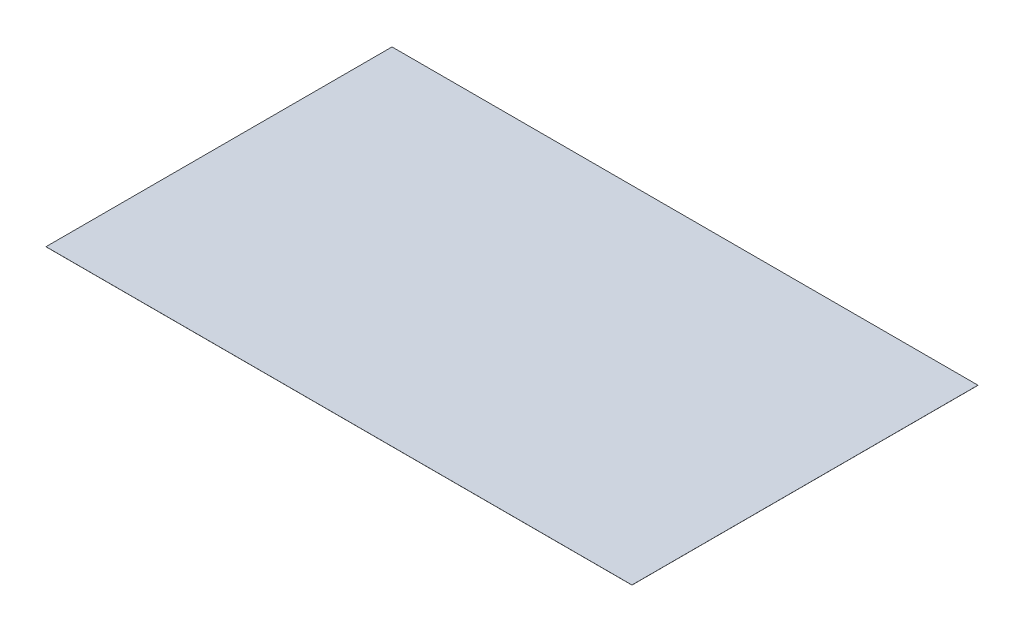
ISO-10303-21;
HEADER;
FILE_DESCRIPTION(('STEP AP214'),'2;1');
FILE_NAME('part.step','',(''),(''),'','','');
FILE_SCHEMA(('AUTOMOTIVE_DESIGN { 1 0 10303 214 1 1 1 1 }'));
ENDSEC;
DATA;
#1=APPLICATION_CONTEXT('core data for automotive mechanical design processes');
#2=APPLICATION_PROTOCOL_DEFINITION('international standard','automotive_design',2000,#1);
#3=PRODUCT_CONTEXT('',#1,'mechanical');
#4=PRODUCT('Part','Part','',(#3));
#5=PRODUCT_RELATED_PRODUCT_CATEGORY('part','',(#4));
#6=PRODUCT_DEFINITION_FORMATION('','',#4);
#7=PRODUCT_DEFINITION_CONTEXT('part definition',#1,'design');
#8=PRODUCT_DEFINITION('design','',#6,#7);
#9=PRODUCT_DEFINITION_SHAPE('','',#8);
#10=(LENGTH_UNIT() NAMED_UNIT(*) SI_UNIT(.MILLI.,.METRE.));
#11=(NAMED_UNIT(*) PLANE_ANGLE_UNIT() SI_UNIT($,.RADIAN.));
#12=(NAMED_UNIT(*) SI_UNIT($,.STERADIAN.) SOLID_ANGLE_UNIT());
#13=UNCERTAINTY_MEASURE_WITH_UNIT(LENGTH_MEASURE(1.E-05),#10,'distance_accuracy_value','');
#14=(GEOMETRIC_REPRESENTATION_CONTEXT(3) GLOBAL_UNCERTAINTY_ASSIGNED_CONTEXT((#13)) GLOBAL_UNIT_ASSIGNED_CONTEXT((#10,
#11,#12)) REPRESENTATION_CONTEXT('',''));
#15=CARTESIAN_POINT('',(0.,0.,0.));
#16=DIRECTION('',(0.,0.,1.));
#17=DIRECTION('',(1.,0.,0.));
#18=AXIS2_PLACEMENT_3D('',#15,#16,#17);
#19=CARTESIAN_POINT('',(66.04,26.52,-8.5));
#20=DIRECTION('',(0.,1.,0.));
#21=DIRECTION('',(0.,0.,-1.));
#22=AXIS2_PLACEMENT_3D('',#19,#20,#21);
#23=PLANE('',#22);
#24=DIRECTION('',(1.,0.,0.));
#25=VECTOR('',#24,1.);
#26=CARTESIAN_POINT('',(0.,26.52,-85.));
#27=LINE('',#26,#25);
#28=CARTESIAN_POINT('',(-63.5,26.52,-85.));
#29=VERTEX_POINT('',#28);
#30=CARTESIAN_POINT('',(63.5,26.52,-85.));
#31=VERTEX_POINT('',#30);
#32=EDGE_CURVE('E54',#29,#31,#27,.T.);
#33=ORIENTED_EDGE('',*,*,#32,.F.);
#34=DIRECTION('',(0.,0.,-1.));
#35=VECTOR('',#34,1.);
#36=CARTESIAN_POINT('',(-63.5,26.52,-47.5));
#37=LINE('',#36,#35);
#38=CARTESIAN_POINT('',(-63.5,26.52,-10.));
#39=VERTEX_POINT('',#38);
#40=EDGE_CURVE('E69',#39,#29,#37,.T.);
#41=ORIENTED_EDGE('',*,*,#40,.F.);
#42=DIRECTION('',(-1.,0.,0.));
#43=VECTOR('',#42,1.);
#44=CARTESIAN_POINT('',(0.,26.52,-10.));
#45=LINE('',#44,#43);
#46=CARTESIAN_POINT('',(63.5,26.52,-10.));
#47=VERTEX_POINT('',#46);
#48=EDGE_CURVE('E21',#47,#39,#45,.T.);
#49=ORIENTED_EDGE('',*,*,#48,.F.);
#50=DIRECTION('',(0.,0.,1.));
#51=VECTOR('',#50,1.);
#52=CARTESIAN_POINT('',(63.5,26.52,-47.5));
#53=LINE('',#52,#51);
#54=EDGE_CURVE('E59',#31,#47,#53,.T.);
#55=ORIENTED_EDGE('',*,*,#54,.F.);
#56=EDGE_LOOP('',(#33,#41,#49,#55));
#57=FACE_BOUND('',#56,.T.);
#58=ADVANCED_FACE('F17',(#57),#23,.T.);
#59=CARTESIAN_POINT('',(-66.04,26.4996,-10.));
#60=DIRECTION('',(0.,0.,1.));
#61=DIRECTION('',(1.,0.,0.));
#62=AXIS2_PLACEMENT_3D('',#59,#60,#61);
#63=PLANE('',#62);
#64=ORIENTED_EDGE('',*,*,#48,.T.);
#65=DIRECTION('',(0.,1.,0.));
#66=VECTOR('',#65,1.);
#67=CARTESIAN_POINT('',(-63.5,26.51,-10.));
#68=LINE('',#67,#66);
#69=CARTESIAN_POINT('',(-63.5,26.5,-10.));
#70=VERTEX_POINT('',#69);
#71=EDGE_CURVE('E80',#70,#39,#68,.T.);
#72=ORIENTED_EDGE('',*,*,#71,.F.);
#73=DIRECTION('',(1.,0.,0.));
#74=VECTOR('',#73,1.);
#75=CARTESIAN_POINT('',(0.,26.5,-10.));
#76=LINE('',#75,#74);
#77=CARTESIAN_POINT('',(63.5,26.5,-10.));
#78=VERTEX_POINT('',#77);
#79=EDGE_CURVE('E75',#70,#78,#76,.T.);
#80=ORIENTED_EDGE('',*,*,#79,.T.);
#81=DIRECTION('',(0.,-1.,0.));
#82=VECTOR('',#81,1.);
#83=CARTESIAN_POINT('',(63.5,26.51,-10.));
#84=LINE('',#83,#82);
#85=EDGE_CURVE('E64',#47,#78,#84,.T.);
#86=ORIENTED_EDGE('',*,*,#85,.F.);
#87=EDGE_LOOP('',(#64,#72,#80,#86));
#88=FACE_BOUND('',#87,.T.);
#89=ADVANCED_FACE('F74',(#88),#63,.T.);
#90=CARTESIAN_POINT('',(63.5,26.4996,-8.5));
#91=DIRECTION('',(1.,0.,0.));
#92=DIRECTION('',(0.,0.,-1.));
#93=AXIS2_PLACEMENT_3D('',#90,#91,#92);
#94=PLANE('',#93);
#95=ORIENTED_EDGE('',*,*,#54,.T.);
#96=ORIENTED_EDGE('',*,*,#85,.T.);
#97=DIRECTION('',(0.,0.,-1.));
#98=VECTOR('',#97,1.);
#99=CARTESIAN_POINT('',(63.5,26.5,-47.5));
#100=LINE('',#99,#98);
#101=CARTESIAN_POINT('',(63.5,26.5,-85.));
#102=VERTEX_POINT('',#101);
#103=EDGE_CURVE('E85',#78,#102,#100,.T.);
#104=ORIENTED_EDGE('',*,*,#103,.T.);
#105=DIRECTION('',(0.,-1.,0.));
#106=VECTOR('',#105,1.);
#107=CARTESIAN_POINT('',(63.5,26.51,-85.));
#108=LINE('',#107,#106);
#109=EDGE_CURVE('E66',#31,#102,#108,.T.);
#110=ORIENTED_EDGE('',*,*,#109,.F.);
#111=EDGE_LOOP('',(#95,#96,#104,#110));
#112=FACE_BOUND('',#111,.T.);
#113=ADVANCED_FACE('F61',(#112),#94,.T.);
#114=CARTESIAN_POINT('',(66.04,26.4996,-85.));
#115=DIRECTION('',(0.,0.,-1.));
#116=DIRECTION('',(-1.,0.,0.));
#117=AXIS2_PLACEMENT_3D('',#114,#115,#116);
#118=PLANE('',#117);
#119=ORIENTED_EDGE('',*,*,#32,.T.);
#120=ORIENTED_EDGE('',*,*,#109,.T.);
#121=DIRECTION('',(-1.,0.,0.));
#122=VECTOR('',#121,1.);
#123=CARTESIAN_POINT('',(0.,26.5,-85.));
#124=LINE('',#123,#122);
#125=CARTESIAN_POINT('',(-63.5,26.5,-85.));
#126=VERTEX_POINT('',#125);
#127=EDGE_CURVE('E27',#102,#126,#124,.T.);
#128=ORIENTED_EDGE('',*,*,#127,.T.);
#129=DIRECTION('',(0.,-1.,0.));
#130=VECTOR('',#129,1.);
#131=CARTESIAN_POINT('',(-63.5,26.51,-85.));
#132=LINE('',#131,#130);
#133=EDGE_CURVE('E35',#29,#126,#132,.T.);
#134=ORIENTED_EDGE('',*,*,#133,.F.);
#135=EDGE_LOOP('',(#119,#120,#128,#134));
#136=FACE_BOUND('',#135,.T.);
#137=ADVANCED_FACE('F89',(#136),#118,.T.);
#138=CARTESIAN_POINT('',(-63.5,26.4996,-86.5));
#139=DIRECTION('',(-1.,0.,0.));
#140=DIRECTION('',(0.,0.,1.));
#141=AXIS2_PLACEMENT_3D('',#138,#139,#140);
#142=PLANE('',#141);
#143=ORIENTED_EDGE('',*,*,#40,.T.);
#144=ORIENTED_EDGE('',*,*,#133,.T.);
#145=DIRECTION('',(0.,0.,1.));
#146=VECTOR('',#145,1.);
#147=CARTESIAN_POINT('',(-63.5,26.5,-47.5));
#148=LINE('',#147,#146);
#149=EDGE_CURVE('E11',#126,#70,#148,.T.);
#150=ORIENTED_EDGE('',*,*,#149,.T.);
#151=ORIENTED_EDGE('',*,*,#71,.T.);
#152=EDGE_LOOP('',(#143,#144,#150,#151));
#153=FACE_BOUND('',#152,.T.);
#154=ADVANCED_FACE('F91',(#153),#142,.T.);
#155=CARTESIAN_POINT('',(66.04,26.5,-8.5));
#156=DIRECTION('',(0.,1.,0.));
#157=DIRECTION('',(0.,0.,-1.));
#158=AXIS2_PLACEMENT_3D('',#155,#156,#157);
#159=PLANE('',#158);
#160=ORIENTED_EDGE('',*,*,#127,.F.);
#161=ORIENTED_EDGE('',*,*,#103,.F.);
#162=ORIENTED_EDGE('',*,*,#79,.F.);
#163=ORIENTED_EDGE('',*,*,#149,.F.);
#164=EDGE_LOOP('',(#160,#161,#162,#163));
#165=FACE_BOUND('',#164,.T.);
#166=ADVANCED_FACE('F19',(#165),#159,.F.);
#167=CLOSED_SHELL('',(#58,#89,#113,#137,#154,#166));
#168=MANIFOLD_SOLID_BREP('B1',#167);
#169=ADVANCED_BREP_SHAPE_REPRESENTATION('',(#18,#168),#14);
#170=SHAPE_DEFINITION_REPRESENTATION(#9,#169);
ENDSEC;
END-ISO-10303-21;
